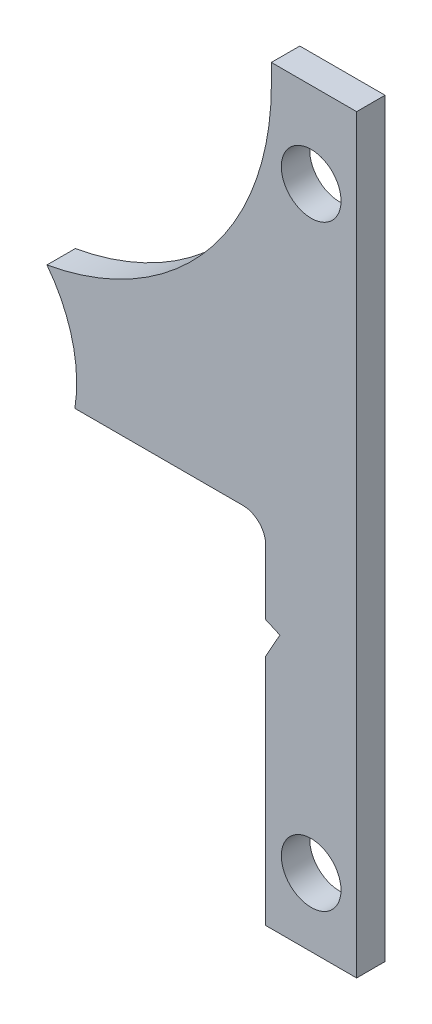
ISO-10303-21;
HEADER;
FILE_DESCRIPTION(('STEP AP214'),'2;1');
FILE_NAME('part.step','',(''),(''),'','','');
FILE_SCHEMA(('AUTOMOTIVE_DESIGN { 1 0 10303 214 1 1 1 1 }'));
ENDSEC;
DATA;
#1=APPLICATION_CONTEXT('core data for automotive mechanical design processes');
#2=APPLICATION_PROTOCOL_DEFINITION('international standard','automotive_design',2000,#1);
#3=PRODUCT_CONTEXT('',#1,'mechanical');
#4=PRODUCT('Part','Part','',(#3));
#5=PRODUCT_RELATED_PRODUCT_CATEGORY('part','',(#4));
#6=PRODUCT_DEFINITION_FORMATION('','',#4);
#7=PRODUCT_DEFINITION_CONTEXT('part definition',#1,'design');
#8=PRODUCT_DEFINITION('design','',#6,#7);
#9=PRODUCT_DEFINITION_SHAPE('','',#8);
#10=(LENGTH_UNIT() NAMED_UNIT(*) SI_UNIT(.MILLI.,.METRE.));
#11=(NAMED_UNIT(*) PLANE_ANGLE_UNIT() SI_UNIT($,.RADIAN.));
#12=(NAMED_UNIT(*) SI_UNIT($,.STERADIAN.) SOLID_ANGLE_UNIT());
#13=UNCERTAINTY_MEASURE_WITH_UNIT(LENGTH_MEASURE(1.E-05),#10,'distance_accuracy_value','');
#14=(GEOMETRIC_REPRESENTATION_CONTEXT(3) GLOBAL_UNCERTAINTY_ASSIGNED_CONTEXT((#13)) GLOBAL_UNIT_ASSIGNED_CONTEXT((#10,
#11,#12)) REPRESENTATION_CONTEXT('',''));
#15=CARTESIAN_POINT('',(0.,0.,0.));
#16=DIRECTION('',(0.,0.,1.));
#17=DIRECTION('',(1.,0.,0.));
#18=AXIS2_PLACEMENT_3D('',#15,#16,#17);
#19=CARTESIAN_POINT('',(0.,66.,2.5));
#20=DIRECTION('',(-1.,0.,0.));
#21=DIRECTION('',(0.,-1.,0.));
#22=AXIS2_PLACEMENT_3D('',#19,#20,#21);
#23=PLANE('',#22);
#24=DIRECTION('',(0.,1.,0.));
#25=VECTOR('',#24,1.);
#26=CARTESIAN_POINT('',(0.,66.,-2.5));
#27=LINE('',#26,#25);
#28=CARTESIAN_POINT('',(0.,-66.,-2.5));
#29=VERTEX_POINT('',#28);
#30=CARTESIAN_POINT('',(0.,66.,-2.5));
#31=VERTEX_POINT('',#30);
#32=EDGE_CURVE('E153',#29,#31,#27,.T.);
#33=ORIENTED_EDGE('',*,*,#32,.T.);
#34=DIRECTION('',(0.,0.,-1.));
#35=VECTOR('',#34,1.);
#36=CARTESIAN_POINT('',(0.,66.,2.5));
#37=LINE('',#36,#35);
#38=CARTESIAN_POINT('',(0.,66.,2.5));
#39=VERTEX_POINT('',#38);
#40=EDGE_CURVE('E11',#39,#31,#37,.T.);
#41=ORIENTED_EDGE('',*,*,#40,.F.);
#42=DIRECTION('',(0.,1.,0.));
#43=VECTOR('',#42,1.);
#44=CARTESIAN_POINT('',(0.,66.,2.5));
#45=LINE('',#44,#43);
#46=CARTESIAN_POINT('',(0.,-66.,2.5));
#47=VERTEX_POINT('',#46);
#48=EDGE_CURVE('E176',#47,#39,#45,.T.);
#49=ORIENTED_EDGE('',*,*,#48,.F.);
#50=DIRECTION('',(0.,0.,-1.));
#51=VECTOR('',#50,1.);
#52=CARTESIAN_POINT('',(0.,-66.,2.5));
#53=LINE('',#52,#51);
#54=EDGE_CURVE('E149',#47,#29,#53,.T.);
#55=ORIENTED_EDGE('',*,*,#54,.T.);
#56=EDGE_LOOP('',(#33,#41,#49,#55));
#57=FACE_BOUND('',#56,.T.);
#58=ADVANCED_FACE('F33',(#57),#23,.F.);
#59=CARTESIAN_POINT('',(0.,66.,2.5));
#60=DIRECTION('',(0.,-1.,0.));
#61=DIRECTION('',(1.,0.,0.));
#62=AXIS2_PLACEMENT_3D('',#59,#60,#61);
#63=PLANE('',#62);
#64=DIRECTION('',(-1.,0.,0.));
#65=VECTOR('',#64,1.);
#66=CARTESIAN_POINT('',(0.,66.,-2.5));
#67=LINE('',#66,#65);
#68=CARTESIAN_POINT('',(-15.,66.,-2.5));
#69=VERTEX_POINT('',#68);
#70=EDGE_CURVE('E156',#31,#69,#67,.T.);
#71=ORIENTED_EDGE('',*,*,#70,.T.);
#72=DIRECTION('',(0.,0.,-1.));
#73=VECTOR('',#72,1.);
#74=CARTESIAN_POINT('',(-15.,66.,2.5));
#75=LINE('',#74,#73);
#76=CARTESIAN_POINT('',(-15.,66.,2.5));
#77=VERTEX_POINT('',#76);
#78=EDGE_CURVE('E41',#77,#69,#75,.T.);
#79=ORIENTED_EDGE('',*,*,#78,.F.);
#80=DIRECTION('',(-1.,0.,0.));
#81=VECTOR('',#80,1.);
#82=CARTESIAN_POINT('',(0.,66.,2.5));
#83=LINE('',#82,#81);
#84=EDGE_CURVE('E104',#39,#77,#83,.T.);
#85=ORIENTED_EDGE('',*,*,#84,.F.);
#86=ORIENTED_EDGE('',*,*,#40,.T.);
#87=EDGE_LOOP('',(#71,#79,#85,#86));
#88=FACE_BOUND('',#87,.T.);
#89=ADVANCED_FACE('F255',(#88),#63,.F.);
#90=CARTESIAN_POINT('',(-15.,66.,2.5));
#91=DIRECTION('',(1.,0.,0.));
#92=DIRECTION('',(0.,0.,-1.));
#93=AXIS2_PLACEMENT_3D('',#90,#91,#92);
#94=PLANE('',#93);
#95=DIRECTION('',(0.,-1.,0.));
#96=VECTOR('',#95,1.);
#97=CARTESIAN_POINT('',(-15.,66.,-2.5));
#98=LINE('',#97,#96);
#99=CARTESIAN_POINT('',(-15.,62.56,-2.5));
#100=VERTEX_POINT('',#99);
#101=EDGE_CURVE('E159',#69,#100,#98,.T.);
#102=ORIENTED_EDGE('',*,*,#101,.T.);
#103=DIRECTION('',(0.,0.,-1.));
#104=VECTOR('',#103,1.);
#105=CARTESIAN_POINT('',(-15.,62.56,2.5));
#106=LINE('',#105,#104);
#107=CARTESIAN_POINT('',(-15.,62.56,2.5));
#108=VERTEX_POINT('',#107);
#109=EDGE_CURVE('E195',#108,#100,#106,.T.);
#110=ORIENTED_EDGE('',*,*,#109,.F.);
#111=DIRECTION('',(0.,-1.,0.));
#112=VECTOR('',#111,1.);
#113=CARTESIAN_POINT('',(-15.,66.,2.5));
#114=LINE('',#113,#112);
#115=EDGE_CURVE('E203',#77,#108,#114,.T.);
#116=ORIENTED_EDGE('',*,*,#115,.F.);
#117=ORIENTED_EDGE('',*,*,#78,.T.);
#118=EDGE_LOOP('',(#102,#110,#116,#117));
#119=FACE_BOUND('',#118,.T.);
#120=ADVANCED_FACE('F201',(#119),#94,.F.);
#121=CARTESIAN_POINT('',(-62.9,62.56,2.5));
#122=DIRECTION('',(0.,0.,-1.));
#123=DIRECTION('',(-1.,0.,0.));
#124=AXIS2_PLACEMENT_3D('',#121,#122,#123);
#125=CYLINDRICAL_SURFACE('',#124,47.9);
#126=CARTESIAN_POINT('',(-62.9,62.56,-2.5));
#127=DIRECTION('',(0.,0.,-1.));
#128=DIRECTION('',(1.,0.,0.));
#129=AXIS2_PLACEMENT_3D('',#126,#127,#128);
#130=CIRCLE('',#129,47.9);
#131=CARTESIAN_POINT('',(-54.4813380343508,15.4056138762455,-2.5));
#132=VERTEX_POINT('',#131);
#133=EDGE_CURVE('E161',#100,#132,#130,.T.);
#134=ORIENTED_EDGE('',*,*,#133,.T.);
#135=DIRECTION('',(0.,0.,-1.));
#136=VECTOR('',#135,1.);
#137=CARTESIAN_POINT('',(-54.4813380343508,15.4056138762455,2.5));
#138=LINE('',#137,#136);
#139=CARTESIAN_POINT('',(-54.4813380343508,15.4056138762455,2.5));
#140=VERTEX_POINT('',#139);
#141=EDGE_CURVE('E192',#140,#132,#138,.T.);
#142=ORIENTED_EDGE('',*,*,#141,.F.);
#143=CARTESIAN_POINT('',(-62.9,62.56,2.5));
#144=DIRECTION('',(0.,0.,-1.));
#145=DIRECTION('',(1.,0.,0.));
#146=AXIS2_PLACEMENT_3D('',#143,#144,#145);
#147=CIRCLE('',#146,47.9);
#148=EDGE_CURVE('E221',#108,#140,#147,.T.);
#149=ORIENTED_EDGE('',*,*,#148,.F.);
#150=ORIENTED_EDGE('',*,*,#109,.T.);
#151=EDGE_LOOP('',(#134,#142,#149,#150));
#152=FACE_BOUND('',#151,.T.);
#153=ADVANCED_FACE('F212',(#152),#125,.F.);
#154=CARTESIAN_POINT('',(-74.52,0.0100000000000009,2.5));
#155=DIRECTION('',(0.,0.,-1.));
#156=DIRECTION('',(-1.,0.,0.));
#157=AXIS2_PLACEMENT_3D('',#154,#155,#156);
#158=CYLINDRICAL_SURFACE('',#157,25.27);
#159=CARTESIAN_POINT('',(-74.52,0.0100000000000009,-2.5));
#160=DIRECTION('',(0.,0.,-1.));
#161=DIRECTION('',(1.,0.,0.));
#162=AXIS2_PLACEMENT_3D('',#159,#160,#161);
#163=CIRCLE('',#162,25.27);
#164=CARTESIAN_POINT('',(-49.5701943895348,-3.99999999999999,-2.5));
#165=VERTEX_POINT('',#164);
#166=EDGE_CURVE('E163',#132,#165,#163,.T.);
#167=ORIENTED_EDGE('',*,*,#166,.T.);
#168=DIRECTION('',(0.,0.,-1.));
#169=VECTOR('',#168,1.);
#170=CARTESIAN_POINT('',(-49.5701943895348,-3.99999999999999,2.5));
#171=LINE('',#170,#169);
#172=CARTESIAN_POINT('',(-49.5701943895348,-3.99999999999999,2.5));
#173=VERTEX_POINT('',#172);
#174=EDGE_CURVE('E189',#173,#165,#171,.T.);
#175=ORIENTED_EDGE('',*,*,#174,.F.);
#176=CARTESIAN_POINT('',(-74.52,0.0100000000000009,2.5));
#177=DIRECTION('',(0.,0.,-1.));
#178=DIRECTION('',(1.,0.,0.));
#179=AXIS2_PLACEMENT_3D('',#176,#177,#178);
#180=CIRCLE('',#179,25.27);
#181=EDGE_CURVE('E218',#140,#173,#180,.T.);
#182=ORIENTED_EDGE('',*,*,#181,.F.);
#183=ORIENTED_EDGE('',*,*,#141,.T.);
#184=EDGE_LOOP('',(#167,#175,#182,#183));
#185=FACE_BOUND('',#184,.T.);
#186=ADVANCED_FACE('F216',(#185),#158,.F.);
#187=CARTESIAN_POINT('',(-49.5701943895348,-4.,2.5));
#188=DIRECTION('',(0.,1.,0.));
#189=DIRECTION('',(-1.,0.,0.));
#190=AXIS2_PLACEMENT_3D('',#187,#188,#189);
#191=PLANE('',#190);
#192=DIRECTION('',(1.,0.,0.));
#193=VECTOR('',#192,1.);
#194=CARTESIAN_POINT('',(-49.5701943895348,-4.,-2.5));
#195=LINE('',#194,#193);
#196=CARTESIAN_POINT('',(-20.,-3.99999999999999,-2.5));
#197=VERTEX_POINT('',#196);
#198=EDGE_CURVE('E165',#165,#197,#195,.T.);
#199=ORIENTED_EDGE('',*,*,#198,.T.);
#200=DIRECTION('',(0.,0.,-1.));
#201=VECTOR('',#200,1.);
#202=CARTESIAN_POINT('',(-20.,-3.99999999999999,2.5));
#203=LINE('',#202,#201);
#204=CARTESIAN_POINT('',(-20.,-3.99999999999999,2.5));
#205=VERTEX_POINT('',#204);
#206=EDGE_CURVE('E186',#205,#197,#203,.T.);
#207=ORIENTED_EDGE('',*,*,#206,.F.);
#208=DIRECTION('',(1.,0.,0.));
#209=VECTOR('',#208,1.);
#210=CARTESIAN_POINT('',(-49.5701943895348,-4.,2.5));
#211=LINE('',#210,#209);
#212=EDGE_CURVE('E220',#173,#205,#211,.T.);
#213=ORIENTED_EDGE('',*,*,#212,.F.);
#214=ORIENTED_EDGE('',*,*,#174,.T.);
#215=EDGE_LOOP('',(#199,#207,#213,#214));
#216=FACE_BOUND('',#215,.T.);
#217=ADVANCED_FACE('F268',(#216),#191,.F.);
#218=CARTESIAN_POINT('',(-20.,-8.,2.5));
#219=DIRECTION('',(0.,0.,-1.));
#220=DIRECTION('',(-1.,0.,0.));
#221=AXIS2_PLACEMENT_3D('',#218,#219,#220);
#222=CYLINDRICAL_SURFACE('',#221,4.);
#223=CARTESIAN_POINT('',(-20.,-8.,-2.5));
#224=DIRECTION('',(0.,0.,-1.));
#225=DIRECTION('',(1.,0.,0.));
#226=AXIS2_PLACEMENT_3D('',#223,#224,#225);
#227=CIRCLE('',#226,4.);
#228=CARTESIAN_POINT('',(-16.,-7.99999999999999,-2.5));
#229=VERTEX_POINT('',#228);
#230=EDGE_CURVE('E167',#197,#229,#227,.T.);
#231=ORIENTED_EDGE('',*,*,#230,.T.);
#232=DIRECTION('',(0.,0.,-1.));
#233=VECTOR('',#232,1.);
#234=CARTESIAN_POINT('',(-16.,-7.99999999999999,2.5));
#235=LINE('',#234,#233);
#236=CARTESIAN_POINT('',(-16.,-7.99999999999999,2.5));
#237=VERTEX_POINT('',#236);
#238=EDGE_CURVE('E183',#237,#229,#235,.T.);
#239=ORIENTED_EDGE('',*,*,#238,.F.);
#240=CARTESIAN_POINT('',(-20.,-8.,2.5));
#241=DIRECTION('',(0.,0.,-1.));
#242=DIRECTION('',(1.,0.,0.));
#243=AXIS2_PLACEMENT_3D('',#240,#241,#242);
#244=CIRCLE('',#243,4.);
#245=EDGE_CURVE('E223',#205,#237,#244,.T.);
#246=ORIENTED_EDGE('',*,*,#245,.F.);
#247=ORIENTED_EDGE('',*,*,#206,.T.);
#248=EDGE_LOOP('',(#231,#239,#246,#247));
#249=FACE_BOUND('',#248,.T.);
#250=ADVANCED_FACE('F271',(#249),#222,.F.);
#251=CARTESIAN_POINT('',(-16.,-19.4030915250128,2.5));
#252=DIRECTION('',(1.,0.,0.));
#253=DIRECTION('',(0.,1.,0.));
#254=AXIS2_PLACEMENT_3D('',#251,#252,#253);
#255=PLANE('',#254);
#256=DIRECTION('',(0.,-1.,0.));
#257=VECTOR('',#256,1.);
#258=CARTESIAN_POINT('',(-16.,-19.4030915250128,-2.5));
#259=LINE('',#258,#257);
#260=CARTESIAN_POINT('',(-16.,-19.4030915250128,-2.5));
#261=VERTEX_POINT('',#260);
#262=EDGE_CURVE('E169',#229,#261,#259,.T.);
#263=ORIENTED_EDGE('',*,*,#262,.T.);
#264=DIRECTION('',(0.,0.,-1.));
#265=VECTOR('',#264,1.);
#266=CARTESIAN_POINT('',(-16.,-19.4030915250128,2.5));
#267=LINE('',#266,#265);
#268=CARTESIAN_POINT('',(-16.,-19.4030915250128,2.5));
#269=VERTEX_POINT('',#268);
#270=EDGE_CURVE('E180',#269,#261,#267,.T.);
#271=ORIENTED_EDGE('',*,*,#270,.F.);
#272=DIRECTION('',(0.,-1.,0.));
#273=VECTOR('',#272,1.);
#274=CARTESIAN_POINT('',(-16.,-19.4030915250128,2.5));
#275=LINE('',#274,#273);
#276=EDGE_CURVE('E229',#237,#269,#275,.T.);
#277=ORIENTED_EDGE('',*,*,#276,.F.);
#278=ORIENTED_EDGE('',*,*,#238,.T.);
#279=EDGE_LOOP('',(#263,#271,#277,#278));
#280=FACE_BOUND('',#279,.T.);
#281=ADVANCED_FACE('F235',(#280),#255,.F.);
#282=CARTESIAN_POINT('',(-16.,-19.4030915250128,2.5));
#283=DIRECTION('',(0.402330683107616,0.915494413653169,0.));
#284=DIRECTION('',(-0.915494413653169,0.402330683107616,0.));
#285=AXIS2_PLACEMENT_3D('',#282,#283,#284);
#286=PLANE('',#285);
#287=DIRECTION('',(0.915494413653169,-0.402330683107616,0.));
#288=VECTOR('',#287,1.);
#289=CARTESIAN_POINT('',(-16.,-19.4030915250128,-2.5));
#290=LINE('',#289,#288);
#291=CARTESIAN_POINT('',(-13.5007002507268,-20.5014542898966,-2.5));
#292=VERTEX_POINT('',#291);
#293=EDGE_CURVE('E171',#261,#292,#290,.T.);
#294=ORIENTED_EDGE('',*,*,#293,.T.);
#295=DIRECTION('',(0.,0.,-1.));
#296=VECTOR('',#295,1.);
#297=CARTESIAN_POINT('',(-13.5007002507268,-20.5014542898966,2.5));
#298=LINE('',#297,#296);
#299=CARTESIAN_POINT('',(-13.5007002507268,-20.5014542898966,2.5));
#300=VERTEX_POINT('',#299);
#301=EDGE_CURVE('E144',#300,#292,#298,.T.);
#302=ORIENTED_EDGE('',*,*,#301,.F.);
#303=DIRECTION('',(0.915494413653169,-0.402330683107616,0.));
#304=VECTOR('',#303,1.);
#305=CARTESIAN_POINT('',(-16.,-19.4030915250128,2.5));
#306=LINE('',#305,#304);
#307=EDGE_CURVE('E135',#269,#300,#306,.T.);
#308=ORIENTED_EDGE('',*,*,#307,.F.);
#309=ORIENTED_EDGE('',*,*,#270,.T.);
#310=EDGE_LOOP('',(#294,#302,#308,#309));
#311=FACE_BOUND('',#310,.T.);
#312=ADVANCED_FACE('F239',(#311),#286,.F.);
#313=CARTESIAN_POINT('',(-13.5007002507268,-20.5014542898966,2.5));
#314=DIRECTION('',(0.872762834004564,-0.488144482279911,0.));
#315=DIRECTION('',(0.488144482279911,0.872762834004564,0.));
#316=AXIS2_PLACEMENT_3D('',#313,#314,#315);
#317=PLANE('',#316);
#318=DIRECTION('',(-0.488144482279911,-0.872762834004564,0.));
#319=VECTOR('',#318,1.);
#320=CARTESIAN_POINT('',(-13.5007002507268,-20.5014542898966,-2.5));
#321=LINE('',#320,#319);
#322=CARTESIAN_POINT('',(-16.,-24.97,-2.5));
#323=VERTEX_POINT('',#322);
#324=EDGE_CURVE('E143',#292,#323,#321,.T.);
#325=ORIENTED_EDGE('',*,*,#324,.T.);
#326=DIRECTION('',(0.,0.,-1.));
#327=VECTOR('',#326,1.);
#328=CARTESIAN_POINT('',(-16.,-24.97,2.5));
#329=LINE('',#328,#327);
#330=CARTESIAN_POINT('',(-16.,-24.97,2.5));
#331=VERTEX_POINT('',#330);
#332=EDGE_CURVE('E140',#331,#323,#329,.T.);
#333=ORIENTED_EDGE('',*,*,#332,.F.);
#334=DIRECTION('',(-0.488144482279911,-0.872762834004564,0.));
#335=VECTOR('',#334,1.);
#336=CARTESIAN_POINT('',(-13.5007002507268,-20.5014542898966,2.5));
#337=LINE('',#336,#335);
#338=EDGE_CURVE('E129',#300,#331,#337,.T.);
#339=ORIENTED_EDGE('',*,*,#338,.F.);
#340=ORIENTED_EDGE('',*,*,#301,.T.);
#341=EDGE_LOOP('',(#325,#333,#339,#340));
#342=FACE_BOUND('',#341,.T.);
#343=ADVANCED_FACE('F141',(#342),#317,.F.);
#344=CARTESIAN_POINT('',(-16.,-24.97,2.5));
#345=DIRECTION('',(1.,0.,0.));
#346=DIRECTION('',(0.,1.,0.));
#347=AXIS2_PLACEMENT_3D('',#344,#345,#346);
#348=PLANE('',#347);
#349=DIRECTION('',(0.,-1.,0.));
#350=VECTOR('',#349,1.);
#351=CARTESIAN_POINT('',(-16.,-24.97,-2.5));
#352=LINE('',#351,#350);
#353=CARTESIAN_POINT('',(-16.,-66.,-2.5));
#354=VERTEX_POINT('',#353);
#355=EDGE_CURVE('E90',#323,#354,#352,.T.);
#356=ORIENTED_EDGE('',*,*,#355,.T.);
#357=DIRECTION('',(0.,0.,-1.));
#358=VECTOR('',#357,1.);
#359=CARTESIAN_POINT('',(-16.,-66.,2.5));
#360=LINE('',#359,#358);
#361=CARTESIAN_POINT('',(-16.,-66.,2.5));
#362=VERTEX_POINT('',#361);
#363=EDGE_CURVE('E145',#362,#354,#360,.T.);
#364=ORIENTED_EDGE('',*,*,#363,.F.);
#365=DIRECTION('',(0.,-1.,0.));
#366=VECTOR('',#365,1.);
#367=CARTESIAN_POINT('',(-16.,-24.97,2.5));
#368=LINE('',#367,#366);
#369=EDGE_CURVE('E133',#331,#362,#368,.T.);
#370=ORIENTED_EDGE('',*,*,#369,.F.);
#371=ORIENTED_EDGE('',*,*,#332,.T.);
#372=EDGE_LOOP('',(#356,#364,#370,#371));
#373=FACE_BOUND('',#372,.T.);
#374=ADVANCED_FACE('F147',(#373),#348,.F.);
#375=CARTESIAN_POINT('',(0.,-66.,2.5));
#376=DIRECTION('',(0.,1.,0.));
#377=DIRECTION('',(0.,0.,1.));
#378=AXIS2_PLACEMENT_3D('',#375,#376,#377);
#379=PLANE('',#378);
#380=DIRECTION('',(1.,0.,0.));
#381=VECTOR('',#380,1.);
#382=CARTESIAN_POINT('',(0.,-66.,-2.5));
#383=LINE('',#382,#381);
#384=EDGE_CURVE('E96',#354,#29,#383,.T.);
#385=ORIENTED_EDGE('',*,*,#384,.T.);
#386=ORIENTED_EDGE('',*,*,#54,.F.);
#387=DIRECTION('',(1.,0.,0.));
#388=VECTOR('',#387,1.);
#389=CARTESIAN_POINT('',(0.,-66.,2.5));
#390=LINE('',#389,#388);
#391=EDGE_CURVE('E49',#362,#47,#390,.T.);
#392=ORIENTED_EDGE('',*,*,#391,.F.);
#393=ORIENTED_EDGE('',*,*,#363,.T.);
#394=EDGE_LOOP('',(#385,#386,#392,#393));
#395=FACE_BOUND('',#394,.T.);
#396=ADVANCED_FACE('F243',(#395),#379,.F.);
#397=CARTESIAN_POINT('',(-20.,-8.,2.5));
#398=DIRECTION('',(0.,0.,1.));
#399=DIRECTION('',(1.,0.,0.));
#400=AXIS2_PLACEMENT_3D('',#397,#398,#399);
#401=PLANE('',#400);
#402=CARTESIAN_POINT('',(-8.,51.,2.5));
#403=DIRECTION('',(0.,0.,1.));
#404=DIRECTION('',(1.,0.,0.));
#405=AXIS2_PLACEMENT_3D('',#402,#403,#404);
#406=CIRCLE('',#405,5.25);
#407=CARTESIAN_POINT('',(-2.75,51.,2.5));
#408=VERTEX_POINT('',#407);
#409=EDGE_CURVE('E336',#408,#408,#406,.T.);
#410=ORIENTED_EDGE('',*,*,#409,.F.);
#411=EDGE_LOOP('',(#410));
#412=FACE_BOUND('',#411,.T.);
#413=CARTESIAN_POINT('',(-8.,-54.,2.5));
#414=DIRECTION('',(0.,0.,1.));
#415=DIRECTION('',(1.,0.,0.));
#416=AXIS2_PLACEMENT_3D('',#413,#414,#415);
#417=CIRCLE('',#416,5.25);
#418=CARTESIAN_POINT('',(-2.75,-54.,2.5));
#419=VERTEX_POINT('',#418);
#420=EDGE_CURVE('E341',#419,#419,#417,.T.);
#421=ORIENTED_EDGE('',*,*,#420,.F.);
#422=EDGE_LOOP('',(#421));
#423=FACE_BOUND('',#422,.T.);
#424=ORIENTED_EDGE('',*,*,#48,.T.);
#425=ORIENTED_EDGE('',*,*,#84,.T.);
#426=ORIENTED_EDGE('',*,*,#115,.T.);
#427=ORIENTED_EDGE('',*,*,#148,.T.);
#428=ORIENTED_EDGE('',*,*,#181,.T.);
#429=ORIENTED_EDGE('',*,*,#212,.T.);
#430=ORIENTED_EDGE('',*,*,#245,.T.);
#431=ORIENTED_EDGE('',*,*,#276,.T.);
#432=ORIENTED_EDGE('',*,*,#307,.T.);
#433=ORIENTED_EDGE('',*,*,#338,.T.);
#434=ORIENTED_EDGE('',*,*,#369,.T.);
#435=ORIENTED_EDGE('',*,*,#391,.T.);
#436=EDGE_LOOP('',(#424,#425,#426,#427,#428,#429,#430,#431,#432,#433,#434,#435));
#437=FACE_BOUND('',#436,.T.);
#438=ADVANCED_FACE('F131',(#412,#423,#437),#401,.T.);
#439=CARTESIAN_POINT('',(-20.,-8.,-2.5));
#440=DIRECTION('',(0.,0.,1.));
#441=DIRECTION('',(1.,0.,0.));
#442=AXIS2_PLACEMENT_3D('',#439,#440,#441);
#443=PLANE('',#442);
#444=CARTESIAN_POINT('',(-8.,51.,-2.5));
#445=DIRECTION('',(0.,0.,1.));
#446=DIRECTION('',(1.,0.,0.));
#447=AXIS2_PLACEMENT_3D('',#444,#445,#446);
#448=CIRCLE('',#447,5.25);
#449=CARTESIAN_POINT('',(-2.75,51.,-2.5));
#450=VERTEX_POINT('',#449);
#451=EDGE_CURVE('E157',#450,#450,#448,.T.);
#452=ORIENTED_EDGE('',*,*,#451,.T.);
#453=EDGE_LOOP('',(#452));
#454=FACE_BOUND('',#453,.T.);
#455=CARTESIAN_POINT('',(-8.,-54.,-2.5));
#456=DIRECTION('',(0.,0.,1.));
#457=DIRECTION('',(1.,0.,0.));
#458=AXIS2_PLACEMENT_3D('',#455,#456,#457);
#459=CIRCLE('',#458,5.25);
#460=CARTESIAN_POINT('',(-2.75,-54.,-2.5));
#461=VERTEX_POINT('',#460);
#462=EDGE_CURVE('E337',#461,#461,#459,.T.);
#463=ORIENTED_EDGE('',*,*,#462,.T.);
#464=EDGE_LOOP('',(#463));
#465=FACE_BOUND('',#464,.T.);
#466=ORIENTED_EDGE('',*,*,#32,.F.);
#467=ORIENTED_EDGE('',*,*,#384,.F.);
#468=ORIENTED_EDGE('',*,*,#355,.F.);
#469=ORIENTED_EDGE('',*,*,#324,.F.);
#470=ORIENTED_EDGE('',*,*,#293,.F.);
#471=ORIENTED_EDGE('',*,*,#262,.F.);
#472=ORIENTED_EDGE('',*,*,#230,.F.);
#473=ORIENTED_EDGE('',*,*,#198,.F.);
#474=ORIENTED_EDGE('',*,*,#166,.F.);
#475=ORIENTED_EDGE('',*,*,#133,.F.);
#476=ORIENTED_EDGE('',*,*,#101,.F.);
#477=ORIENTED_EDGE('',*,*,#70,.F.);
#478=EDGE_LOOP('',(#466,#467,#468,#469,#470,#471,#472,#473,#474,#475,#476,#477));
#479=FACE_BOUND('',#478,.T.);
#480=ADVANCED_FACE('F207',(#454,#465,#479),#443,.F.);
#481=CARTESIAN_POINT('',(-8.,-54.,-2.5));
#482=DIRECTION('',(0.,0.,1.));
#483=DIRECTION('',(1.,0.,0.));
#484=AXIS2_PLACEMENT_3D('',#481,#482,#483);
#485=CYLINDRICAL_SURFACE('',#484,5.25);
#486=ORIENTED_EDGE('',*,*,#462,.F.);
#487=EDGE_LOOP('',(#486));
#488=FACE_BOUND('',#487,.T.);
#489=ORIENTED_EDGE('',*,*,#420,.T.);
#490=EDGE_LOOP('',(#489));
#491=FACE_BOUND('',#490,.T.);
#492=ADVANCED_FACE('F308',(#488,#491),#485,.F.);
#493=CARTESIAN_POINT('',(-8.,51.,-2.5));
#494=DIRECTION('',(0.,0.,1.));
#495=DIRECTION('',(1.,0.,0.));
#496=AXIS2_PLACEMENT_3D('',#493,#494,#495);
#497=CYLINDRICAL_SURFACE('',#496,5.25);
#498=ORIENTED_EDGE('',*,*,#451,.F.);
#499=EDGE_LOOP('',(#498));
#500=FACE_BOUND('',#499,.T.);
#501=ORIENTED_EDGE('',*,*,#409,.T.);
#502=EDGE_LOOP('',(#501));
#503=FACE_BOUND('',#502,.T.);
#504=ADVANCED_FACE('F317',(#500,#503),#497,.F.);
#505=CLOSED_SHELL('',(#58,#89,#120,#153,#186,#217,#250,#281,#312,#343,#374,#396,#438,#480,#492,#504));
#506=MANIFOLD_SOLID_BREP('B2',#505);
#507=ADVANCED_BREP_SHAPE_REPRESENTATION('',(#18,#506),#14);
#508=SHAPE_DEFINITION_REPRESENTATION(#9,#507);
ENDSEC;
END-ISO-10303-21;
